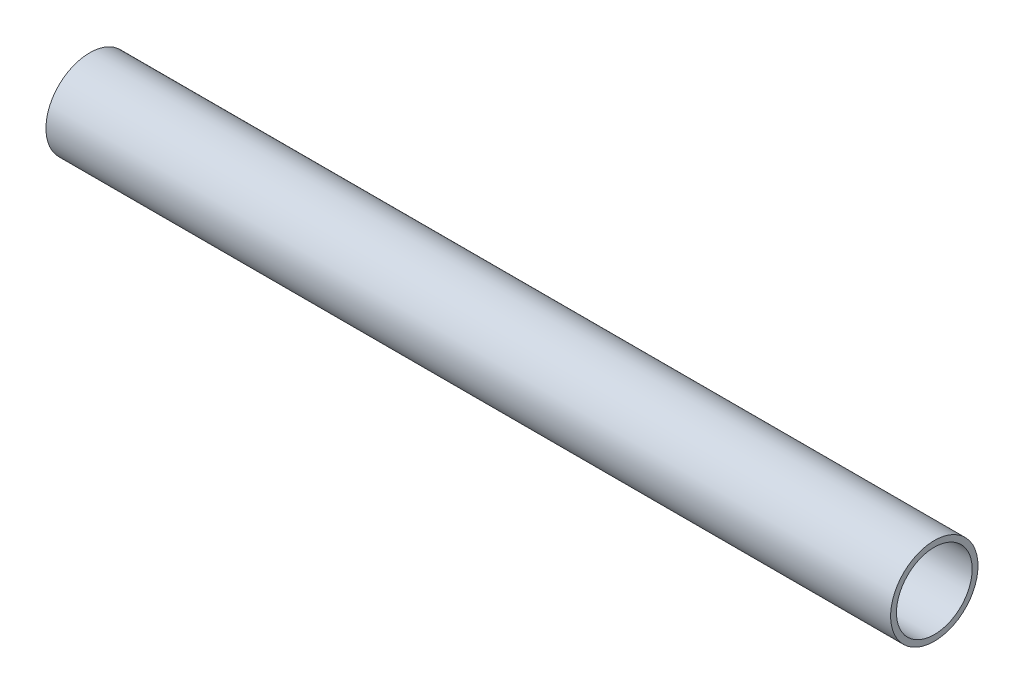
ISO-10303-21;
HEADER;
FILE_DESCRIPTION(('STEP AP214'),'2;1');
FILE_NAME('part.step','',(''),(''),'','','');
FILE_SCHEMA(('AUTOMOTIVE_DESIGN { 1 0 10303 214 1 1 1 1 }'));
ENDSEC;
DATA;
#1=APPLICATION_CONTEXT('core data for automotive mechanical design processes');
#2=APPLICATION_PROTOCOL_DEFINITION('international standard','automotive_design',2000,#1);
#3=PRODUCT_CONTEXT('',#1,'mechanical');
#4=PRODUCT('Part','Part','',(#3));
#5=PRODUCT_RELATED_PRODUCT_CATEGORY('part','',(#4));
#6=PRODUCT_DEFINITION_FORMATION('','',#4);
#7=PRODUCT_DEFINITION_CONTEXT('part definition',#1,'design');
#8=PRODUCT_DEFINITION('design','',#6,#7);
#9=PRODUCT_DEFINITION_SHAPE('','',#8);
#10=(LENGTH_UNIT() NAMED_UNIT(*) SI_UNIT(.MILLI.,.METRE.));
#11=(NAMED_UNIT(*) PLANE_ANGLE_UNIT() SI_UNIT($,.RADIAN.));
#12=(NAMED_UNIT(*) SI_UNIT($,.STERADIAN.) SOLID_ANGLE_UNIT());
#13=UNCERTAINTY_MEASURE_WITH_UNIT(LENGTH_MEASURE(1.E-05),#10,'distance_accuracy_value','');
#14=(GEOMETRIC_REPRESENTATION_CONTEXT(3) GLOBAL_UNCERTAINTY_ASSIGNED_CONTEXT((#13)) GLOBAL_UNIT_ASSIGNED_CONTEXT((#10,
#11,#12)) REPRESENTATION_CONTEXT('',''));
#15=CARTESIAN_POINT('',(0.,0.,0.));
#16=DIRECTION('',(0.,0.,1.));
#17=DIRECTION('',(1.,0.,0.));
#18=AXIS2_PLACEMENT_3D('',#15,#16,#17);
#19=CARTESIAN_POINT('',(145.,0.,0.));
#20=DIRECTION('',(1.,0.,0.));
#21=DIRECTION('',(0.,0.,-1.));
#22=AXIS2_PLACEMENT_3D('',#19,#20,#21);
#23=PLANE('',#22);
#24=CARTESIAN_POINT('',(145.,0.,0.));
#25=DIRECTION('',(1.,0.,0.));
#26=DIRECTION('',(0.,0.,-1.));
#27=AXIS2_PLACEMENT_3D('',#24,#25,#26);
#28=CIRCLE('',#27,7.5);
#29=CARTESIAN_POINT('',(145.,0.,-7.5));
#30=VERTEX_POINT('',#29);
#31=EDGE_CURVE('E10',#30,#30,#28,.T.);
#32=ORIENTED_EDGE('',*,*,#31,.T.);
#33=EDGE_LOOP('',(#32));
#34=FACE_BOUND('',#33,.T.);
#35=CARTESIAN_POINT('',(145.,0.,0.));
#36=DIRECTION('',(1.,0.,0.));
#37=DIRECTION('',(0.,0.,-1.));
#38=AXIS2_PLACEMENT_3D('',#35,#36,#37);
#39=CIRCLE('',#38,6.5);
#40=CARTESIAN_POINT('',(145.,0.,-6.5));
#41=VERTEX_POINT('',#40);
#42=EDGE_CURVE('E42',#41,#41,#39,.T.);
#43=ORIENTED_EDGE('',*,*,#42,.F.);
#44=EDGE_LOOP('',(#43));
#45=FACE_BOUND('',#44,.T.);
#46=ADVANCED_FACE('F31',(#34,#45),#23,.T.);
#47=CARTESIAN_POINT('',(0.,0.,0.));
#48=DIRECTION('',(1.,0.,0.));
#49=DIRECTION('',(0.,0.,-1.));
#50=AXIS2_PLACEMENT_3D('',#47,#48,#49);
#51=PLANE('',#50);
#52=CARTESIAN_POINT('',(0.,0.,0.));
#53=DIRECTION('',(1.,0.,0.));
#54=DIRECTION('',(0.,0.,-1.));
#55=AXIS2_PLACEMENT_3D('',#52,#53,#54);
#56=CIRCLE('',#55,7.5);
#57=CARTESIAN_POINT('',(0.,0.,-7.5));
#58=VERTEX_POINT('',#57);
#59=EDGE_CURVE('E35',#58,#58,#56,.T.);
#60=ORIENTED_EDGE('',*,*,#59,.F.);
#61=EDGE_LOOP('',(#60));
#62=FACE_BOUND('',#61,.T.);
#63=CARTESIAN_POINT('',(0.,0.,0.));
#64=DIRECTION('',(1.,0.,0.));
#65=DIRECTION('',(0.,0.,-1.));
#66=AXIS2_PLACEMENT_3D('',#63,#64,#65);
#67=CIRCLE('',#66,6.5);
#68=CARTESIAN_POINT('',(0.,0.,-6.5));
#69=VERTEX_POINT('',#68);
#70=EDGE_CURVE('E44',#69,#69,#67,.T.);
#71=ORIENTED_EDGE('',*,*,#70,.T.);
#72=EDGE_LOOP('',(#71));
#73=FACE_BOUND('',#72,.T.);
#74=ADVANCED_FACE('F54',(#62,#73),#51,.F.);
#75=CARTESIAN_POINT('',(145.,0.,0.));
#76=DIRECTION('',(-1.,0.,0.));
#77=DIRECTION('',(0.,0.,1.));
#78=AXIS2_PLACEMENT_3D('',#75,#76,#77);
#79=CYLINDRICAL_SURFACE('',#78,7.5);
#80=ORIENTED_EDGE('',*,*,#31,.F.);
#81=EDGE_LOOP('',(#80));
#82=FACE_BOUND('',#81,.T.);
#83=ORIENTED_EDGE('',*,*,#59,.T.);
#84=EDGE_LOOP('',(#83));
#85=FACE_BOUND('',#84,.T.);
#86=ADVANCED_FACE('F33',(#82,#85),#79,.T.);
#87=CARTESIAN_POINT('',(145.,0.,0.));
#88=DIRECTION('',(-1.,0.,0.));
#89=DIRECTION('',(0.,0.,1.));
#90=AXIS2_PLACEMENT_3D('',#87,#88,#89);
#91=CYLINDRICAL_SURFACE('',#90,6.5);
#92=ORIENTED_EDGE('',*,*,#42,.T.);
#93=EDGE_LOOP('',(#92));
#94=FACE_BOUND('',#93,.T.);
#95=ORIENTED_EDGE('',*,*,#70,.F.);
#96=EDGE_LOOP('',(#95));
#97=FACE_BOUND('',#96,.T.);
#98=ADVANCED_FACE('F50',(#94,#97),#91,.F.);
#99=CLOSED_SHELL('',(#46,#74,#86,#98));
#100=MANIFOLD_SOLID_BREP('B2',#99);
#101=ADVANCED_BREP_SHAPE_REPRESENTATION('',(#18,#100),#14);
#102=SHAPE_DEFINITION_REPRESENTATION(#9,#101);
ENDSEC;
END-ISO-10303-21;
